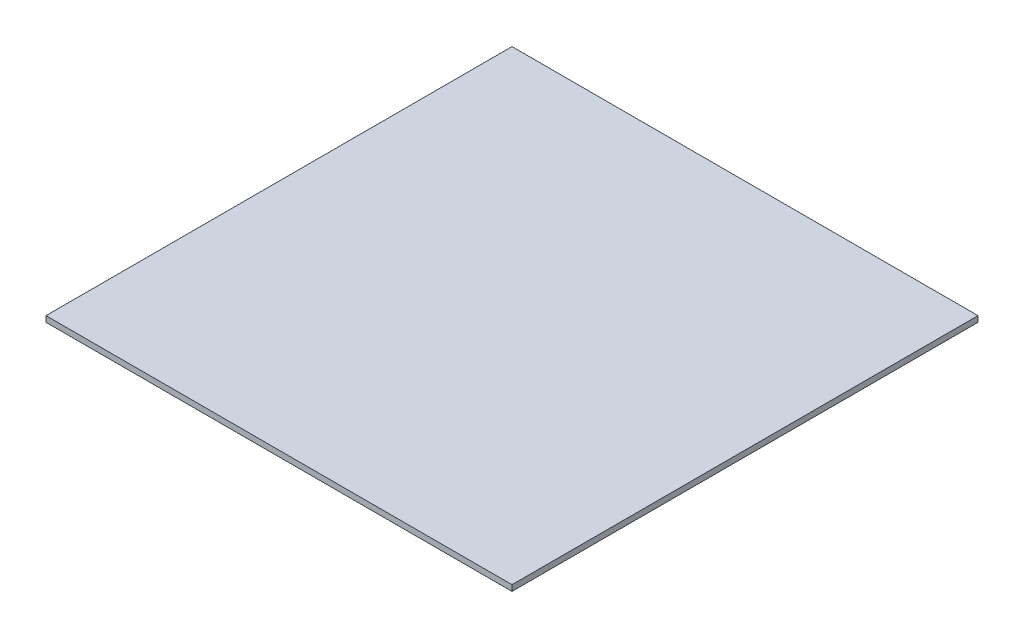
ISO-10303-21;
HEADER;
FILE_DESCRIPTION(('STEP AP214'),'2;1');
FILE_NAME('part.step','',(''),(''),'','','');
FILE_SCHEMA(('AUTOMOTIVE_DESIGN { 1 0 10303 214 1 1 1 1 }'));
ENDSEC;
DATA;
#1=APPLICATION_CONTEXT('core data for automotive mechanical design processes');
#2=APPLICATION_PROTOCOL_DEFINITION('international standard','automotive_design',2000,#1);
#3=PRODUCT_CONTEXT('',#1,'mechanical');
#4=PRODUCT('Part','Part','',(#3));
#5=PRODUCT_RELATED_PRODUCT_CATEGORY('part','',(#4));
#6=PRODUCT_DEFINITION_FORMATION('','',#4);
#7=PRODUCT_DEFINITION_CONTEXT('part definition',#1,'design');
#8=PRODUCT_DEFINITION('design','',#6,#7);
#9=PRODUCT_DEFINITION_SHAPE('','',#8);
#10=(LENGTH_UNIT() NAMED_UNIT(*) SI_UNIT(.MILLI.,.METRE.));
#11=(NAMED_UNIT(*) PLANE_ANGLE_UNIT() SI_UNIT($,.RADIAN.));
#12=(NAMED_UNIT(*) SI_UNIT($,.STERADIAN.) SOLID_ANGLE_UNIT());
#13=UNCERTAINTY_MEASURE_WITH_UNIT(LENGTH_MEASURE(1.E-05),#10,'distance_accuracy_value','');
#14=(GEOMETRIC_REPRESENTATION_CONTEXT(3) GLOBAL_UNCERTAINTY_ASSIGNED_CONTEXT((#13)) GLOBAL_UNIT_ASSIGNED_CONTEXT((#10,
#11,#12)) REPRESENTATION_CONTEXT('',''));
#15=CARTESIAN_POINT('',(0.,0.,0.));
#16=DIRECTION('',(0.,0.,1.));
#17=DIRECTION('',(1.,0.,0.));
#18=AXIS2_PLACEMENT_3D('',#15,#16,#17);
#19=CARTESIAN_POINT('',(127.,3.175,127.));
#20=DIRECTION('',(-1.,0.,0.));
#21=DIRECTION('',(0.,0.,1.));
#22=AXIS2_PLACEMENT_3D('',#19,#20,#21);
#23=PLANE('',#22);
#24=DIRECTION('',(0.,0.,-1.));
#25=VECTOR('',#24,1.);
#26=CARTESIAN_POINT('',(127.,0.,127.));
#27=LINE('',#26,#25);
#28=CARTESIAN_POINT('',(127.,0.,127.));
#29=VERTEX_POINT('',#28);
#30=CARTESIAN_POINT('',(127.,0.,-127.));
#31=VERTEX_POINT('',#30);
#32=EDGE_CURVE('E98',#29,#31,#27,.T.);
#33=ORIENTED_EDGE('',*,*,#32,.T.);
#34=DIRECTION('',(0.,-1.,0.));
#35=VECTOR('',#34,1.);
#36=CARTESIAN_POINT('',(127.,3.175,-127.));
#37=LINE('',#36,#35);
#38=CARTESIAN_POINT('',(127.,3.175,-127.));
#39=VERTEX_POINT('',#38);
#40=EDGE_CURVE('E11',#39,#31,#37,.T.);
#41=ORIENTED_EDGE('',*,*,#40,.F.);
#42=DIRECTION('',(0.,0.,-1.));
#43=VECTOR('',#42,1.);
#44=CARTESIAN_POINT('',(127.,3.175,127.));
#45=LINE('',#44,#43);
#46=CARTESIAN_POINT('',(127.,3.175,127.));
#47=VERTEX_POINT('',#46);
#48=EDGE_CURVE('E86',#47,#39,#45,.T.);
#49=ORIENTED_EDGE('',*,*,#48,.F.);
#50=DIRECTION('',(0.,-1.,0.));
#51=VECTOR('',#50,1.);
#52=CARTESIAN_POINT('',(127.,3.175,127.));
#53=LINE('',#52,#51);
#54=EDGE_CURVE('E94',#47,#29,#53,.T.);
#55=ORIENTED_EDGE('',*,*,#54,.T.);
#56=EDGE_LOOP('',(#33,#41,#49,#55));
#57=FACE_BOUND('',#56,.T.);
#58=ADVANCED_FACE('F35',(#57),#23,.F.);
#59=CARTESIAN_POINT('',(-127.,3.175,-127.));
#60=DIRECTION('',(0.,0.,1.));
#61=DIRECTION('',(1.,0.,0.));
#62=AXIS2_PLACEMENT_3D('',#59,#60,#61);
#63=PLANE('',#62);
#64=DIRECTION('',(-1.,0.,0.));
#65=VECTOR('',#64,1.);
#66=CARTESIAN_POINT('',(-127.,0.,-127.));
#67=LINE('',#66,#65);
#68=CARTESIAN_POINT('',(-127.,0.,-127.));
#69=VERTEX_POINT('',#68);
#70=EDGE_CURVE('E90',#31,#69,#67,.T.);
#71=ORIENTED_EDGE('',*,*,#70,.T.);
#72=DIRECTION('',(0.,-1.,0.));
#73=VECTOR('',#72,1.);
#74=CARTESIAN_POINT('',(-127.,3.175,-127.));
#75=LINE('',#74,#73);
#76=CARTESIAN_POINT('',(-127.,3.175,-127.));
#77=VERTEX_POINT('',#76);
#78=EDGE_CURVE('E43',#77,#69,#75,.T.);
#79=ORIENTED_EDGE('',*,*,#78,.F.);
#80=DIRECTION('',(-1.,0.,0.));
#81=VECTOR('',#80,1.);
#82=CARTESIAN_POINT('',(-127.,3.175,-127.));
#83=LINE('',#82,#81);
#84=EDGE_CURVE('E81',#39,#77,#83,.T.);
#85=ORIENTED_EDGE('',*,*,#84,.F.);
#86=ORIENTED_EDGE('',*,*,#40,.T.);
#87=EDGE_LOOP('',(#71,#79,#85,#86));
#88=FACE_BOUND('',#87,.T.);
#89=ADVANCED_FACE('F89',(#88),#63,.F.);
#90=CARTESIAN_POINT('',(-127.,3.175,127.));
#91=DIRECTION('',(1.,0.,0.));
#92=DIRECTION('',(0.,0.,-1.));
#93=AXIS2_PLACEMENT_3D('',#90,#91,#92);
#94=PLANE('',#93);
#95=DIRECTION('',(0.,0.,1.));
#96=VECTOR('',#95,1.);
#97=CARTESIAN_POINT('',(-127.,0.,127.));
#98=LINE('',#97,#96);
#99=CARTESIAN_POINT('',(-127.,0.,127.));
#100=VERTEX_POINT('',#99);
#101=EDGE_CURVE('E68',#69,#100,#98,.T.);
#102=ORIENTED_EDGE('',*,*,#101,.T.);
#103=DIRECTION('',(0.,-1.,0.));
#104=VECTOR('',#103,1.);
#105=CARTESIAN_POINT('',(-127.,3.175,127.));
#106=LINE('',#105,#104);
#107=CARTESIAN_POINT('',(-127.,3.175,127.));
#108=VERTEX_POINT('',#107);
#109=EDGE_CURVE('E91',#108,#100,#106,.T.);
#110=ORIENTED_EDGE('',*,*,#109,.F.);
#111=DIRECTION('',(0.,0.,1.));
#112=VECTOR('',#111,1.);
#113=CARTESIAN_POINT('',(-127.,3.175,127.));
#114=LINE('',#113,#112);
#115=EDGE_CURVE('E84',#77,#108,#114,.T.);
#116=ORIENTED_EDGE('',*,*,#115,.F.);
#117=ORIENTED_EDGE('',*,*,#78,.T.);
#118=EDGE_LOOP('',(#102,#110,#116,#117));
#119=FACE_BOUND('',#118,.T.);
#120=ADVANCED_FACE('F92',(#119),#94,.F.);
#121=CARTESIAN_POINT('',(-127.,3.175,127.));
#122=DIRECTION('',(0.,0.,-1.));
#123=DIRECTION('',(-1.,0.,0.));
#124=AXIS2_PLACEMENT_3D('',#121,#122,#123);
#125=PLANE('',#124);
#126=DIRECTION('',(1.,0.,0.));
#127=VECTOR('',#126,1.);
#128=CARTESIAN_POINT('',(-127.,0.,127.));
#129=LINE('',#128,#127);
#130=EDGE_CURVE('E74',#100,#29,#129,.T.);
#131=ORIENTED_EDGE('',*,*,#130,.T.);
#132=ORIENTED_EDGE('',*,*,#54,.F.);
#133=DIRECTION('',(1.,0.,0.));
#134=VECTOR('',#133,1.);
#135=CARTESIAN_POINT('',(-127.,3.175,127.));
#136=LINE('',#135,#134);
#137=EDGE_CURVE('E51',#108,#47,#136,.T.);
#138=ORIENTED_EDGE('',*,*,#137,.F.);
#139=ORIENTED_EDGE('',*,*,#109,.T.);
#140=EDGE_LOOP('',(#131,#132,#138,#139));
#141=FACE_BOUND('',#140,.T.);
#142=ADVANCED_FACE('F105',(#141),#125,.F.);
#143=CARTESIAN_POINT('',(0.,3.175,0.));
#144=DIRECTION('',(0.,-1.,0.));
#145=DIRECTION('',(0.,0.,-1.));
#146=AXIS2_PLACEMENT_3D('',#143,#144,#145);
#147=PLANE('',#146);
#148=ORIENTED_EDGE('',*,*,#48,.T.);
#149=ORIENTED_EDGE('',*,*,#84,.T.);
#150=ORIENTED_EDGE('',*,*,#115,.T.);
#151=ORIENTED_EDGE('',*,*,#137,.T.);
#152=EDGE_LOOP('',(#148,#149,#150,#151));
#153=FACE_BOUND('',#152,.T.);
#154=ADVANCED_FACE('F82',(#153),#147,.F.);
#155=CARTESIAN_POINT('',(0.,0.,0.));
#156=DIRECTION('',(0.,-1.,0.));
#157=DIRECTION('',(0.,0.,-1.));
#158=AXIS2_PLACEMENT_3D('',#155,#156,#157);
#159=PLANE('',#158);
#160=ORIENTED_EDGE('',*,*,#32,.F.);
#161=ORIENTED_EDGE('',*,*,#130,.F.);
#162=ORIENTED_EDGE('',*,*,#101,.F.);
#163=ORIENTED_EDGE('',*,*,#70,.F.);
#164=EDGE_LOOP('',(#160,#161,#162,#163));
#165=FACE_BOUND('',#164,.T.);
#166=ADVANCED_FACE('F108',(#165),#159,.T.);
#167=CLOSED_SHELL('',(#58,#89,#120,#142,#154,#166));
#168=MANIFOLD_SOLID_BREP('B2',#167);
#169=ADVANCED_BREP_SHAPE_REPRESENTATION('',(#18,#168),#14);
#170=SHAPE_DEFINITION_REPRESENTATION(#9,#169);
ENDSEC;
END-ISO-10303-21;
